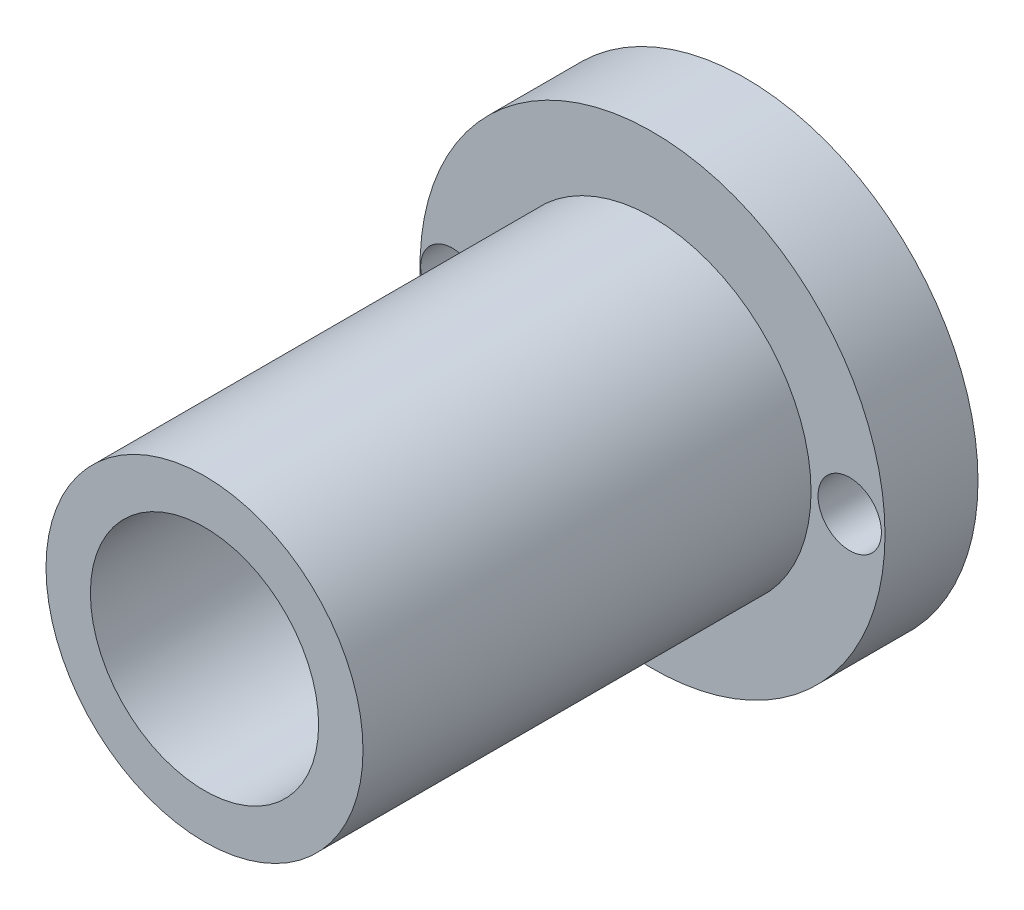
ISO-10303-21;
HEADER;
FILE_DESCRIPTION(('STEP AP214'),'2;1');
FILE_NAME('part.step','',(''),(''),'','','');
FILE_SCHEMA(('AUTOMOTIVE_DESIGN { 1 0 10303 214 1 1 1 1 }'));
ENDSEC;
DATA;
#1=APPLICATION_CONTEXT('core data for automotive mechanical design processes');
#2=APPLICATION_PROTOCOL_DEFINITION('international standard','automotive_design',2000,#1);
#3=PRODUCT_CONTEXT('',#1,'mechanical');
#4=PRODUCT('Part','Part','',(#3));
#5=PRODUCT_RELATED_PRODUCT_CATEGORY('part','',(#4));
#6=PRODUCT_DEFINITION_FORMATION('','',#4);
#7=PRODUCT_DEFINITION_CONTEXT('part definition',#1,'design');
#8=PRODUCT_DEFINITION('design','',#6,#7);
#9=PRODUCT_DEFINITION_SHAPE('','',#8);
#10=(LENGTH_UNIT() NAMED_UNIT(*) SI_UNIT(.MILLI.,.METRE.));
#11=(NAMED_UNIT(*) PLANE_ANGLE_UNIT() SI_UNIT($,.RADIAN.));
#12=(NAMED_UNIT(*) SI_UNIT($,.STERADIAN.) SOLID_ANGLE_UNIT());
#13=UNCERTAINTY_MEASURE_WITH_UNIT(LENGTH_MEASURE(1.E-05),#10,'distance_accuracy_value','');
#14=(GEOMETRIC_REPRESENTATION_CONTEXT(3) GLOBAL_UNCERTAINTY_ASSIGNED_CONTEXT((#13)) GLOBAL_UNIT_ASSIGNED_CONTEXT((#10,
#11,#12)) REPRESENTATION_CONTEXT('',''));
#15=CARTESIAN_POINT('',(0.,0.,0.));
#16=DIRECTION('',(0.,0.,1.));
#17=DIRECTION('',(1.,0.,0.));
#18=AXIS2_PLACEMENT_3D('',#15,#16,#17);
#19=CARTESIAN_POINT('',(0.,0.,22.));
#20=DIRECTION('',(0.,0.,-1.));
#21=DIRECTION('',(-1.,0.,0.));
#22=AXIS2_PLACEMENT_3D('',#19,#20,#21);
#23=CYLINDRICAL_SURFACE('',#22,55.);
#24=CARTESIAN_POINT('',(0.,0.,22.));
#25=DIRECTION('',(0.,0.,1.));
#26=DIRECTION('',(1.,0.,0.));
#27=AXIS2_PLACEMENT_3D('',#24,#25,#26);
#28=CIRCLE('',#27,55.);
#29=CARTESIAN_POINT('',(55.,0.,22.));
#30=VERTEX_POINT('',#29);
#31=EDGE_CURVE('E10',#30,#30,#28,.T.);
#32=ORIENTED_EDGE('',*,*,#31,.F.);
#33=EDGE_LOOP('',(#32));
#34=FACE_BOUND('',#33,.T.);
#35=CARTESIAN_POINT('',(0.,0.,0.));
#36=DIRECTION('',(0.,0.,1.));
#37=DIRECTION('',(1.,0.,0.));
#38=AXIS2_PLACEMENT_3D('',#35,#36,#37);
#39=CIRCLE('',#38,55.);
#40=CARTESIAN_POINT('',(55.,0.,0.));
#41=VERTEX_POINT('',#40);
#42=EDGE_CURVE('E41',#41,#41,#39,.T.);
#43=ORIENTED_EDGE('',*,*,#42,.T.);
#44=EDGE_LOOP('',(#43));
#45=FACE_BOUND('',#44,.T.);
#46=ADVANCED_FACE('F38',(#34,#45),#23,.T.);
#47=CARTESIAN_POINT('',(0.,0.,22.));
#48=DIRECTION('',(0.,0.,1.));
#49=DIRECTION('',(1.,0.,0.));
#50=AXIS2_PLACEMENT_3D('',#47,#48,#49);
#51=PLANE('',#50);
#52=CARTESIAN_POINT('',(-47.3563745930192,0.,22.));
#53=DIRECTION('',(0.,0.,1.));
#54=DIRECTION('',(1.,0.,0.));
#55=AXIS2_PLACEMENT_3D('',#52,#53,#54);
#56=CIRCLE('',#55,7.5);
#57=CARTESIAN_POINT('',(-39.8563745930192,0.,22.));
#58=VERTEX_POINT('',#57);
#59=EDGE_CURVE('E66',#58,#58,#56,.T.);
#60=ORIENTED_EDGE('',*,*,#59,.F.);
#61=EDGE_LOOP('',(#60));
#62=FACE_BOUND('',#61,.T.);
#63=CARTESIAN_POINT('',(46.6497504322801,0.,22.));
#64=DIRECTION('',(0.,0.,1.));
#65=DIRECTION('',(1.,0.,0.));
#66=AXIS2_PLACEMENT_3D('',#63,#64,#65);
#67=CIRCLE('',#66,7.5);
#68=CARTESIAN_POINT('',(54.1497504322801,0.,22.));
#69=VERTEX_POINT('',#68);
#70=EDGE_CURVE('E59',#69,#69,#67,.T.);
#71=ORIENTED_EDGE('',*,*,#70,.F.);
#72=EDGE_LOOP('',(#71));
#73=FACE_BOUND('',#72,.T.);
#74=CARTESIAN_POINT('',(0.,0.,22.));
#75=DIRECTION('',(0.,0.,1.));
#76=DIRECTION('',(1.,0.,0.));
#77=AXIS2_PLACEMENT_3D('',#74,#75,#76);
#78=CIRCLE('',#77,37.5);
#79=CARTESIAN_POINT('',(37.5,0.,22.));
#80=VERTEX_POINT('',#79);
#81=EDGE_CURVE('E50',#80,#80,#78,.T.);
#82=ORIENTED_EDGE('',*,*,#81,.F.);
#83=EDGE_LOOP('',(#82));
#84=FACE_BOUND('',#83,.T.);
#85=ORIENTED_EDGE('',*,*,#31,.T.);
#86=EDGE_LOOP('',(#85));
#87=FACE_BOUND('',#86,.T.);
#88=ADVANCED_FACE('F95',(#62,#73,#84,#87),#51,.T.);
#89=CARTESIAN_POINT('',(0.,0.,0.));
#90=DIRECTION('',(0.,0.,1.));
#91=DIRECTION('',(1.,0.,0.));
#92=AXIS2_PLACEMENT_3D('',#89,#90,#91);
#93=PLANE('',#92);
#94=CARTESIAN_POINT('',(0.,0.,0.));
#95=DIRECTION('',(0.,0.,1.));
#96=DIRECTION('',(1.,0.,0.));
#97=AXIS2_PLACEMENT_3D('',#94,#95,#96);
#98=CIRCLE('',#97,27.);
#99=CARTESIAN_POINT('',(27.,0.,0.));
#100=VERTEX_POINT('',#99);
#101=EDGE_CURVE('E63',#100,#100,#98,.T.);
#102=ORIENTED_EDGE('',*,*,#101,.T.);
#103=EDGE_LOOP('',(#102));
#104=FACE_BOUND('',#103,.T.);
#105=CARTESIAN_POINT('',(-47.3563745930192,0.,0.));
#106=DIRECTION('',(0.,0.,1.));
#107=DIRECTION('',(1.,0.,0.));
#108=AXIS2_PLACEMENT_3D('',#105,#106,#107);
#109=CIRCLE('',#108,7.5);
#110=CARTESIAN_POINT('',(-39.8563745930192,0.,0.));
#111=VERTEX_POINT('',#110);
#112=EDGE_CURVE('E58',#111,#111,#109,.T.);
#113=ORIENTED_EDGE('',*,*,#112,.T.);
#114=EDGE_LOOP('',(#113));
#115=FACE_BOUND('',#114,.T.);
#116=CARTESIAN_POINT('',(46.6497504322801,0.,0.));
#117=DIRECTION('',(0.,0.,1.));
#118=DIRECTION('',(1.,0.,0.));
#119=AXIS2_PLACEMENT_3D('',#116,#117,#118);
#120=CIRCLE('',#119,7.5);
#121=CARTESIAN_POINT('',(54.1497504322801,0.,0.));
#122=VERTEX_POINT('',#121);
#123=EDGE_CURVE('E62',#122,#122,#120,.T.);
#124=ORIENTED_EDGE('',*,*,#123,.T.);
#125=EDGE_LOOP('',(#124));
#126=FACE_BOUND('',#125,.T.);
#127=ORIENTED_EDGE('',*,*,#42,.F.);
#128=EDGE_LOOP('',(#127));
#129=FACE_BOUND('',#128,.T.);
#130=ADVANCED_FACE('F74',(#104,#115,#126,#129),#93,.F.);
#131=CARTESIAN_POINT('',(0.,0.,128.));
#132=DIRECTION('',(0.,0.,1.));
#133=DIRECTION('',(1.,0.,0.));
#134=AXIS2_PLACEMENT_3D('',#131,#132,#133);
#135=PLANE('',#134);
#136=CARTESIAN_POINT('',(0.,0.,128.));
#137=DIRECTION('',(0.,0.,1.));
#138=DIRECTION('',(1.,0.,0.));
#139=AXIS2_PLACEMENT_3D('',#136,#137,#138);
#140=CIRCLE('',#139,37.5);
#141=CARTESIAN_POINT('',(37.5,0.,128.));
#142=VERTEX_POINT('',#141);
#143=EDGE_CURVE('E48',#142,#142,#140,.T.);
#144=ORIENTED_EDGE('',*,*,#143,.T.);
#145=EDGE_LOOP('',(#144));
#146=FACE_BOUND('',#145,.T.);
#147=CARTESIAN_POINT('',(0.,0.,128.));
#148=DIRECTION('',(0.,0.,1.));
#149=DIRECTION('',(1.,0.,0.));
#150=AXIS2_PLACEMENT_3D('',#147,#148,#149);
#151=CIRCLE('',#150,27.);
#152=CARTESIAN_POINT('',(27.,0.,128.));
#153=VERTEX_POINT('',#152);
#154=EDGE_CURVE('E53',#153,#153,#151,.T.);
#155=ORIENTED_EDGE('',*,*,#154,.F.);
#156=EDGE_LOOP('',(#155));
#157=FACE_BOUND('',#156,.T.);
#158=ADVANCED_FACE('F90',(#146,#157),#135,.T.);
#159=CARTESIAN_POINT('',(0.,0.,128.));
#160=DIRECTION('',(0.,0.,-1.));
#161=DIRECTION('',(-1.,0.,0.));
#162=AXIS2_PLACEMENT_3D('',#159,#160,#161);
#163=CYLINDRICAL_SURFACE('',#162,37.5);
#164=ORIENTED_EDGE('',*,*,#143,.F.);
#165=EDGE_LOOP('',(#164));
#166=FACE_BOUND('',#165,.T.);
#167=ORIENTED_EDGE('',*,*,#81,.T.);
#168=EDGE_LOOP('',(#167));
#169=FACE_BOUND('',#168,.T.);
#170=ADVANCED_FACE('F80',(#166,#169),#163,.T.);
#171=CARTESIAN_POINT('',(0.,0.,128.));
#172=DIRECTION('',(0.,0.,-1.));
#173=DIRECTION('',(-1.,0.,0.));
#174=AXIS2_PLACEMENT_3D('',#171,#172,#173);
#175=CYLINDRICAL_SURFACE('',#174,27.);
#176=ORIENTED_EDGE('',*,*,#154,.T.);
#177=EDGE_LOOP('',(#176));
#178=FACE_BOUND('',#177,.T.);
#179=ORIENTED_EDGE('',*,*,#101,.F.);
#180=EDGE_LOOP('',(#179));
#181=FACE_BOUND('',#180,.T.);
#182=ADVANCED_FACE('F77',(#178,#181),#175,.F.);
#183=CARTESIAN_POINT('',(46.6497504322801,0.,0.));
#184=DIRECTION('',(0.,0.,1.));
#185=DIRECTION('',(1.,0.,0.));
#186=AXIS2_PLACEMENT_3D('',#183,#184,#185);
#187=CYLINDRICAL_SURFACE('',#186,7.5);
#188=ORIENTED_EDGE('',*,*,#123,.F.);
#189=EDGE_LOOP('',(#188));
#190=FACE_BOUND('',#189,.T.);
#191=ORIENTED_EDGE('',*,*,#70,.T.);
#192=EDGE_LOOP('',(#191));
#193=FACE_BOUND('',#192,.T.);
#194=ADVANCED_FACE('F79',(#190,#193),#187,.F.);
#195=CARTESIAN_POINT('',(-47.3563745930192,0.,0.));
#196=DIRECTION('',(0.,0.,1.));
#197=DIRECTION('',(1.,0.,0.));
#198=AXIS2_PLACEMENT_3D('',#195,#196,#197);
#199=CYLINDRICAL_SURFACE('',#198,7.5);
#200=ORIENTED_EDGE('',*,*,#112,.F.);
#201=EDGE_LOOP('',(#200));
#202=FACE_BOUND('',#201,.T.);
#203=ORIENTED_EDGE('',*,*,#59,.T.);
#204=EDGE_LOOP('',(#203));
#205=FACE_BOUND('',#204,.T.);
#206=ADVANCED_FACE('F87',(#202,#205),#199,.F.);
#207=CLOSED_SHELL('',(#46,#88,#130,#158,#170,#182,#194,#206));
#208=MANIFOLD_SOLID_BREP('B2',#207);
#209=ADVANCED_BREP_SHAPE_REPRESENTATION('',(#18,#208),#14);
#210=SHAPE_DEFINITION_REPRESENTATION(#9,#209);
ENDSEC;
END-ISO-10303-21;
